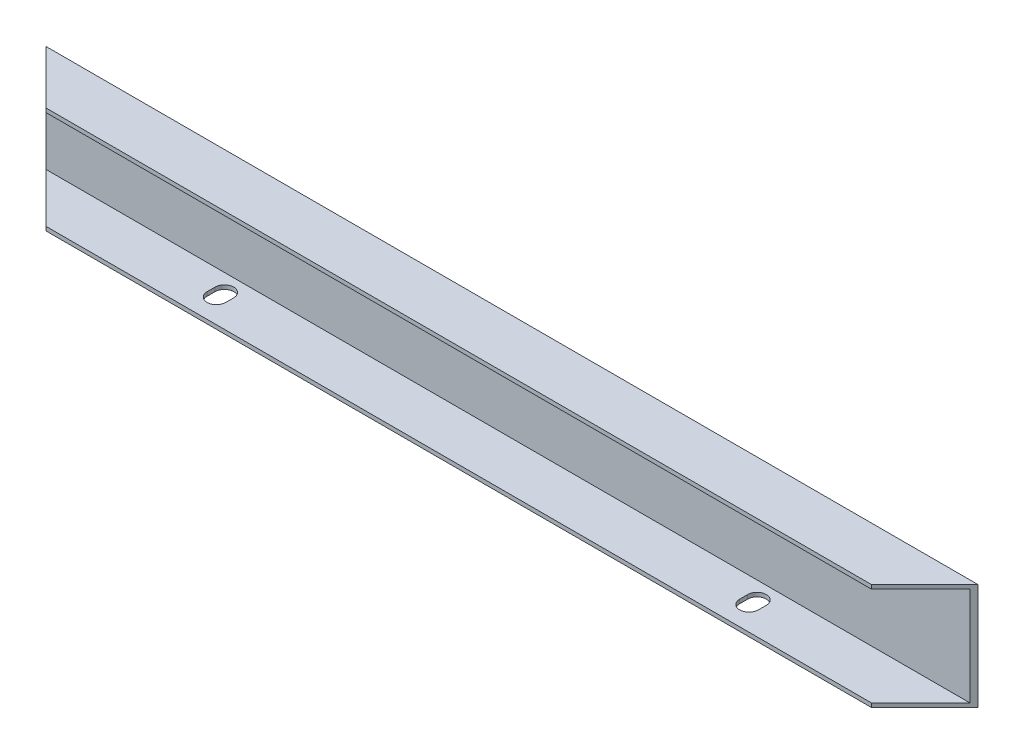
ISO-10303-21;
HEADER;
FILE_DESCRIPTION(('STEP AP214'),'2;1');
FILE_NAME('part.step','',(''),(''),'','','');
FILE_SCHEMA(('AUTOMOTIVE_DESIGN { 1 0 10303 214 1 1 1 1 }'));
ENDSEC;
DATA;
#1=APPLICATION_CONTEXT('core data for automotive mechanical design processes');
#2=APPLICATION_PROTOCOL_DEFINITION('international standard','automotive_design',2000,#1);
#3=PRODUCT_CONTEXT('',#1,'mechanical');
#4=PRODUCT('Part','Part','',(#3));
#5=PRODUCT_RELATED_PRODUCT_CATEGORY('part','',(#4));
#6=PRODUCT_DEFINITION_FORMATION('','',#4);
#7=PRODUCT_DEFINITION_CONTEXT('part definition',#1,'design');
#8=PRODUCT_DEFINITION('design','',#6,#7);
#9=PRODUCT_DEFINITION_SHAPE('','',#8);
#10=(LENGTH_UNIT() NAMED_UNIT(*) SI_UNIT(.MILLI.,.METRE.));
#11=(NAMED_UNIT(*) PLANE_ANGLE_UNIT() SI_UNIT($,.RADIAN.));
#12=(NAMED_UNIT(*) SI_UNIT($,.STERADIAN.) SOLID_ANGLE_UNIT());
#13=UNCERTAINTY_MEASURE_WITH_UNIT(LENGTH_MEASURE(1.E-05),#10,'distance_accuracy_value','');
#14=(GEOMETRIC_REPRESENTATION_CONTEXT(3) GLOBAL_UNCERTAINTY_ASSIGNED_CONTEXT((#13)) GLOBAL_UNIT_ASSIGNED_CONTEXT((#10,
#11,#12)) REPRESENTATION_CONTEXT('',''));
#15=CARTESIAN_POINT('',(0.,0.,0.));
#16=DIRECTION('',(0.,0.,1.));
#17=DIRECTION('',(1.,0.,0.));
#18=AXIS2_PLACEMENT_3D('',#15,#16,#17);
#19=CARTESIAN_POINT('',(175.,20.,0.));
#20=DIRECTION('',(0.,-1.,0.));
#21=DIRECTION('',(0.,0.,-1.));
#22=AXIS2_PLACEMENT_3D('',#19,#20,#21);
#23=PLANE('',#22);
#24=DIRECTION('',(-1.,0.,0.));
#25=VECTOR('',#24,1.);
#26=CARTESIAN_POINT('',(175.,20.,0.));
#27=LINE('',#26,#25);
#28=CARTESIAN_POINT('',(175.,20.,0.));
#29=VERTEX_POINT('',#28);
#30=CARTESIAN_POINT('',(-175.,20.,0.));
#31=VERTEX_POINT('',#30);
#32=EDGE_CURVE('E245',#29,#31,#27,.T.);
#33=ORIENTED_EDGE('',*,*,#32,.T.);
#34=DIRECTION('',(0.707106781186548,0.,0.707106781186547));
#35=VECTOR('',#34,1.);
#36=CARTESIAN_POINT('',(1.38777878078145E-13,20.,175.));
#37=LINE('',#36,#35);
#38=CARTESIAN_POINT('',(-155.,20.,20.));
#39=VERTEX_POINT('',#38);
#40=EDGE_CURVE('E224',#31,#39,#37,.T.);
#41=ORIENTED_EDGE('',*,*,#40,.T.);
#42=DIRECTION('',(-1.,0.,0.));
#43=VECTOR('',#42,1.);
#44=CARTESIAN_POINT('',(175.,20.,20.));
#45=LINE('',#44,#43);
#46=CARTESIAN_POINT('',(155.,20.,20.));
#47=VERTEX_POINT('',#46);
#48=EDGE_CURVE('E11',#47,#39,#45,.T.);
#49=ORIENTED_EDGE('',*,*,#48,.F.);
#50=DIRECTION('',(0.707106781186548,0.,-0.707106781186547));
#51=VECTOR('',#50,1.);
#52=CARTESIAN_POINT('',(175.,20.,0.));
#53=LINE('',#52,#51);
#54=EDGE_CURVE('E239',#47,#29,#53,.T.);
#55=ORIENTED_EDGE('',*,*,#54,.T.);
#56=EDGE_LOOP('',(#33,#41,#49,#55));
#57=FACE_BOUND('',#56,.T.);
#58=ADVANCED_FACE('F33',(#57),#23,.F.);
#59=CARTESIAN_POINT('',(175.,20.,20.));
#60=DIRECTION('',(0.,0.,-1.));
#61=DIRECTION('',(-1.,0.,0.));
#62=AXIS2_PLACEMENT_3D('',#59,#60,#61);
#63=PLANE('',#62);
#64=ORIENTED_EDGE('',*,*,#48,.T.);
#65=DIRECTION('',(0.,1.,0.));
#66=VECTOR('',#65,1.);
#67=CARTESIAN_POINT('',(-155.,-30.,20.));
#68=LINE('',#67,#66);
#69=CARTESIAN_POINT('',(-155.,18.5,20.));
#70=VERTEX_POINT('',#69);
#71=EDGE_CURVE('E206',#70,#39,#68,.T.);
#72=ORIENTED_EDGE('',*,*,#71,.F.);
#73=DIRECTION('',(-1.,0.,0.));
#74=VECTOR('',#73,1.);
#75=CARTESIAN_POINT('',(175.,18.5,20.));
#76=LINE('',#75,#74);
#77=CARTESIAN_POINT('',(155.,18.5,20.));
#78=VERTEX_POINT('',#77);
#79=EDGE_CURVE('E40',#78,#70,#76,.T.);
#80=ORIENTED_EDGE('',*,*,#79,.F.);
#81=DIRECTION('',(0.,1.,0.));
#82=VECTOR('',#81,1.);
#83=CARTESIAN_POINT('',(155.,-30.,20.));
#84=LINE('',#83,#82);
#85=EDGE_CURVE('E178',#78,#47,#84,.T.);
#86=ORIENTED_EDGE('',*,*,#85,.T.);
#87=EDGE_LOOP('',(#64,#72,#80,#86));
#88=FACE_BOUND('',#87,.T.);
#89=ADVANCED_FACE('F271',(#88),#63,.F.);
#90=CARTESIAN_POINT('',(175.,18.5,20.));
#91=DIRECTION('',(0.,1.,0.));
#92=DIRECTION('',(0.,0.,1.));
#93=AXIS2_PLACEMENT_3D('',#90,#91,#92);
#94=PLANE('',#93);
#95=ORIENTED_EDGE('',*,*,#79,.T.);
#96=DIRECTION('',(-0.707106781186548,0.,-0.707106781186547));
#97=VECTOR('',#96,1.);
#98=CARTESIAN_POINT('',(10.0000000000001,18.5,185.));
#99=LINE('',#98,#97);
#100=CARTESIAN_POINT('',(-173.5,18.5,1.5));
#101=VERTEX_POINT('',#100);
#102=EDGE_CURVE('E221',#70,#101,#99,.T.);
#103=ORIENTED_EDGE('',*,*,#102,.T.);
#104=DIRECTION('',(-1.,0.,0.));
#105=VECTOR('',#104,1.);
#106=CARTESIAN_POINT('',(175.,18.5,1.5));
#107=LINE('',#106,#105);
#108=CARTESIAN_POINT('',(173.5,18.5,1.5));
#109=VERTEX_POINT('',#108);
#110=EDGE_CURVE('E262',#109,#101,#107,.T.);
#111=ORIENTED_EDGE('',*,*,#110,.F.);
#112=DIRECTION('',(-0.707106781186548,0.,0.707106781186547));
#113=VECTOR('',#112,1.);
#114=CARTESIAN_POINT('',(165.,18.5,9.99999999999999));
#115=LINE('',#114,#113);
#116=EDGE_CURVE('E236',#109,#78,#115,.T.);
#117=ORIENTED_EDGE('',*,*,#116,.T.);
#118=EDGE_LOOP('',(#95,#103,#111,#117));
#119=FACE_BOUND('',#118,.T.);
#120=ADVANCED_FACE('F267',(#119),#94,.F.);
#121=CARTESIAN_POINT('',(175.,18.5,1.5));
#122=DIRECTION('',(0.,0.,-1.));
#123=DIRECTION('',(-1.,0.,0.));
#124=AXIS2_PLACEMENT_3D('',#121,#122,#123);
#125=PLANE('',#124);
#126=ORIENTED_EDGE('',*,*,#110,.T.);
#127=DIRECTION('',(0.,-1.,0.));
#128=VECTOR('',#127,1.);
#129=CARTESIAN_POINT('',(-173.5,18.5000000000001,1.5));
#130=LINE('',#129,#128);
#131=CARTESIAN_POINT('',(-173.5,-18.5,1.5));
#132=VERTEX_POINT('',#131);
#133=EDGE_CURVE('E218',#101,#132,#130,.T.);
#134=ORIENTED_EDGE('',*,*,#133,.T.);
#135=DIRECTION('',(-1.,0.,0.));
#136=VECTOR('',#135,1.);
#137=CARTESIAN_POINT('',(175.,-18.5,1.5));
#138=LINE('',#137,#136);
#139=CARTESIAN_POINT('',(173.5,-18.5,1.5));
#140=VERTEX_POINT('',#139);
#141=EDGE_CURVE('E259',#140,#132,#138,.T.);
#142=ORIENTED_EDGE('',*,*,#141,.F.);
#143=DIRECTION('',(0.,1.,0.));
#144=VECTOR('',#143,1.);
#145=CARTESIAN_POINT('',(173.5,18.5,1.5));
#146=LINE('',#145,#144);
#147=EDGE_CURVE('E233',#140,#109,#146,.T.);
#148=ORIENTED_EDGE('',*,*,#147,.T.);
#149=EDGE_LOOP('',(#126,#134,#142,#148));
#150=FACE_BOUND('',#149,.T.);
#151=ADVANCED_FACE('F292',(#150),#125,.F.);
#152=CARTESIAN_POINT('',(175.,-18.5,20.));
#153=DIRECTION('',(0.,-1.,0.));
#154=DIRECTION('',(0.,0.,-1.));
#155=AXIS2_PLACEMENT_3D('',#152,#153,#154);
#156=PLANE('',#155);
#157=DIRECTION('',(0.,0.,-1.));
#158=VECTOR('',#157,1.);
#159=CARTESIAN_POINT('',(-96.5,-18.5,8.));
#160=LINE('',#159,#158);
#161=CARTESIAN_POINT('',(-96.5,-18.5,11.));
#162=VERTEX_POINT('',#161);
#163=CARTESIAN_POINT('',(-96.5,-18.5,8.));
#164=VERTEX_POINT('',#163);
#165=EDGE_CURVE('E426',#162,#164,#160,.T.);
#166=ORIENTED_EDGE('',*,*,#165,.F.);
#167=CARTESIAN_POINT('',(-100.,-18.5,11.));
#168=DIRECTION('',(0.,-1.,0.));
#169=DIRECTION('',(0.,0.,-1.));
#170=AXIS2_PLACEMENT_3D('',#167,#168,#169);
#171=CIRCLE('',#170,3.5);
#172=CARTESIAN_POINT('',(-103.5,-18.5,11.));
#173=VERTEX_POINT('',#172);
#174=EDGE_CURVE('E179',#173,#162,#171,.F.);
#175=ORIENTED_EDGE('',*,*,#174,.F.);
#176=DIRECTION('',(0.,0.,1.));
#177=VECTOR('',#176,1.);
#178=CARTESIAN_POINT('',(-103.5,-18.5,11.));
#179=LINE('',#178,#177);
#180=CARTESIAN_POINT('',(-103.5,-18.5,8.));
#181=VERTEX_POINT('',#180);
#182=EDGE_CURVE('E176',#181,#173,#179,.T.);
#183=ORIENTED_EDGE('',*,*,#182,.F.);
#184=CARTESIAN_POINT('',(-100.,-18.5,8.));
#185=DIRECTION('',(0.,-1.,0.));
#186=DIRECTION('',(0.,0.,-1.));
#187=AXIS2_PLACEMENT_3D('',#184,#185,#186);
#188=CIRCLE('',#187,3.5);
#189=EDGE_CURVE('E150',#164,#181,#188,.F.);
#190=ORIENTED_EDGE('',*,*,#189,.F.);
#191=EDGE_LOOP('',(#166,#175,#183,#190));
#192=FACE_BOUND('',#191,.T.);
#193=DIRECTION('',(0.,0.,-1.));
#194=VECTOR('',#193,1.);
#195=CARTESIAN_POINT('',(103.5,-18.5,11.));
#196=LINE('',#195,#194);
#197=CARTESIAN_POINT('',(103.5,-18.5,11.));
#198=VERTEX_POINT('',#197);
#199=CARTESIAN_POINT('',(103.5,-18.5,8.00000000000002));
#200=VERTEX_POINT('',#199);
#201=EDGE_CURVE('E182',#198,#200,#196,.T.);
#202=ORIENTED_EDGE('',*,*,#201,.F.);
#203=CARTESIAN_POINT('',(100.,-18.5,11.));
#204=DIRECTION('',(0.,-1.,0.));
#205=DIRECTION('',(0.,0.,-1.));
#206=AXIS2_PLACEMENT_3D('',#203,#204,#205);
#207=CIRCLE('',#206,3.5);
#208=CARTESIAN_POINT('',(96.5,-18.5,11.));
#209=VERTEX_POINT('',#208);
#210=EDGE_CURVE('E185',#209,#198,#207,.F.);
#211=ORIENTED_EDGE('',*,*,#210,.F.);
#212=DIRECTION('',(0.,0.,1.));
#213=VECTOR('',#212,1.);
#214=CARTESIAN_POINT('',(96.5,-18.5,8.00000000000002));
#215=LINE('',#214,#213);
#216=CARTESIAN_POINT('',(96.5,-18.5,8.00000000000002));
#217=VERTEX_POINT('',#216);
#218=EDGE_CURVE('E187',#217,#209,#215,.T.);
#219=ORIENTED_EDGE('',*,*,#218,.F.);
#220=CARTESIAN_POINT('',(100.,-18.5,8.00000000000002));
#221=DIRECTION('',(0.,-1.,0.));
#222=DIRECTION('',(0.,0.,-1.));
#223=AXIS2_PLACEMENT_3D('',#220,#221,#222);
#224=CIRCLE('',#223,3.5);
#225=EDGE_CURVE('E180',#200,#217,#224,.F.);
#226=ORIENTED_EDGE('',*,*,#225,.F.);
#227=EDGE_LOOP('',(#202,#211,#219,#226));
#228=FACE_BOUND('',#227,.T.);
#229=ORIENTED_EDGE('',*,*,#141,.T.);
#230=DIRECTION('',(0.707106781186548,0.,0.707106781186547));
#231=VECTOR('',#230,1.);
#232=CARTESIAN_POINT('',(10.0000000000001,-18.5,185.));
#233=LINE('',#232,#231);
#234=CARTESIAN_POINT('',(-155.,-18.5,20.));
#235=VERTEX_POINT('',#234);
#236=EDGE_CURVE('E215',#132,#235,#233,.T.);
#237=ORIENTED_EDGE('',*,*,#236,.T.);
#238=DIRECTION('',(-1.,0.,0.));
#239=VECTOR('',#238,1.);
#240=CARTESIAN_POINT('',(175.,-18.5,20.));
#241=LINE('',#240,#239);
#242=CARTESIAN_POINT('',(155.,-18.5,20.));
#243=VERTEX_POINT('',#242);
#244=EDGE_CURVE('E256',#243,#235,#241,.T.);
#245=ORIENTED_EDGE('',*,*,#244,.F.);
#246=DIRECTION('',(0.707106781186548,0.,-0.707106781186547));
#247=VECTOR('',#246,1.);
#248=CARTESIAN_POINT('',(165.,-18.5,9.99999999999999));
#249=LINE('',#248,#247);
#250=EDGE_CURVE('E230',#243,#140,#249,.T.);
#251=ORIENTED_EDGE('',*,*,#250,.T.);
#252=EDGE_LOOP('',(#229,#237,#245,#251));
#253=FACE_BOUND('',#252,.T.);
#254=ADVANCED_FACE('F289',(#192,#228,#253),#156,.F.);
#255=CARTESIAN_POINT('',(175.,-20.,20.));
#256=DIRECTION('',(0.,0.,-1.));
#257=DIRECTION('',(-1.,0.,0.));
#258=AXIS2_PLACEMENT_3D('',#255,#256,#257);
#259=PLANE('',#258);
#260=ORIENTED_EDGE('',*,*,#244,.T.);
#261=CARTESIAN_POINT('',(-155.,-20.,20.));
#262=VERTEX_POINT('',#261);
#263=EDGE_CURVE('E208',#262,#235,#68,.T.);
#264=ORIENTED_EDGE('',*,*,#263,.F.);
#265=DIRECTION('',(-1.,0.,0.));
#266=VECTOR('',#265,1.);
#267=CARTESIAN_POINT('',(175.,-20.,20.));
#268=LINE('',#267,#266);
#269=CARTESIAN_POINT('',(155.,-20.,20.));
#270=VERTEX_POINT('',#269);
#271=EDGE_CURVE('E253',#270,#262,#268,.T.);
#272=ORIENTED_EDGE('',*,*,#271,.F.);
#273=EDGE_CURVE('E209',#270,#243,#84,.T.);
#274=ORIENTED_EDGE('',*,*,#273,.T.);
#275=EDGE_LOOP('',(#260,#264,#272,#274));
#276=FACE_BOUND('',#275,.T.);
#277=ADVANCED_FACE('F286',(#276),#259,.F.);
#278=CARTESIAN_POINT('',(175.,-20.,0.));
#279=DIRECTION('',(0.,1.,0.));
#280=DIRECTION('',(0.,0.,1.));
#281=AXIS2_PLACEMENT_3D('',#278,#279,#280);
#282=PLANE('',#281);
#283=DIRECTION('',(0.,0.,-1.));
#284=VECTOR('',#283,1.);
#285=CARTESIAN_POINT('',(-103.5,-20.,11.));
#286=LINE('',#285,#284);
#287=CARTESIAN_POINT('',(-103.5,-20.,11.));
#288=VERTEX_POINT('',#287);
#289=CARTESIAN_POINT('',(-103.5,-20.,8.));
#290=VERTEX_POINT('',#289);
#291=EDGE_CURVE('E157',#288,#290,#286,.T.);
#292=ORIENTED_EDGE('',*,*,#291,.F.);
#293=CARTESIAN_POINT('',(-100.,-20.,11.));
#294=DIRECTION('',(0.,-1.,0.));
#295=DIRECTION('',(0.,0.,-1.));
#296=AXIS2_PLACEMENT_3D('',#293,#294,#295);
#297=CIRCLE('',#296,3.5);
#298=CARTESIAN_POINT('',(-96.5,-20.,11.));
#299=VERTEX_POINT('',#298);
#300=EDGE_CURVE('E162',#299,#288,#297,.T.);
#301=ORIENTED_EDGE('',*,*,#300,.F.);
#302=DIRECTION('',(0.,0.,1.));
#303=VECTOR('',#302,1.);
#304=CARTESIAN_POINT('',(-96.5,-20.,8.));
#305=LINE('',#304,#303);
#306=CARTESIAN_POINT('',(-96.5,-20.,8.));
#307=VERTEX_POINT('',#306);
#308=EDGE_CURVE('E167',#307,#299,#305,.T.);
#309=ORIENTED_EDGE('',*,*,#308,.F.);
#310=CARTESIAN_POINT('',(-100.,-20.,8.));
#311=DIRECTION('',(0.,-1.,0.));
#312=DIRECTION('',(0.,0.,-1.));
#313=AXIS2_PLACEMENT_3D('',#310,#311,#312);
#314=CIRCLE('',#313,3.5);
#315=EDGE_CURVE('E147',#290,#307,#314,.T.);
#316=ORIENTED_EDGE('',*,*,#315,.F.);
#317=EDGE_LOOP('',(#292,#301,#309,#316));
#318=FACE_BOUND('',#317,.T.);
#319=DIRECTION('',(0.,0.,-1.));
#320=VECTOR('',#319,1.);
#321=CARTESIAN_POINT('',(96.5,-20.,8.00000000000002));
#322=LINE('',#321,#320);
#323=CARTESIAN_POINT('',(96.5,-20.,11.));
#324=VERTEX_POINT('',#323);
#325=CARTESIAN_POINT('',(96.5,-20.,8.00000000000002));
#326=VERTEX_POINT('',#325);
#327=EDGE_CURVE('E190',#324,#326,#322,.T.);
#328=ORIENTED_EDGE('',*,*,#327,.F.);
#329=CARTESIAN_POINT('',(100.,-20.,11.));
#330=DIRECTION('',(0.,-1.,0.));
#331=DIRECTION('',(0.,0.,1.));
#332=AXIS2_PLACEMENT_3D('',#329,#330,#331);
#333=CIRCLE('',#332,3.5);
#334=CARTESIAN_POINT('',(103.5,-20.,11.));
#335=VERTEX_POINT('',#334);
#336=EDGE_CURVE('E188',#335,#324,#333,.T.);
#337=ORIENTED_EDGE('',*,*,#336,.F.);
#338=DIRECTION('',(0.,0.,1.));
#339=VECTOR('',#338,1.);
#340=CARTESIAN_POINT('',(103.5,-20.,11.));
#341=LINE('',#340,#339);
#342=CARTESIAN_POINT('',(103.5,-20.,8.00000000000002));
#343=VERTEX_POINT('',#342);
#344=EDGE_CURVE('E195',#343,#335,#341,.T.);
#345=ORIENTED_EDGE('',*,*,#344,.F.);
#346=CARTESIAN_POINT('',(100.,-20.,8.00000000000002));
#347=DIRECTION('',(0.,-1.,0.));
#348=DIRECTION('',(0.,0.,1.));
#349=AXIS2_PLACEMENT_3D('',#346,#347,#348);
#350=CIRCLE('',#349,3.5);
#351=EDGE_CURVE('E192',#326,#343,#350,.T.);
#352=ORIENTED_EDGE('',*,*,#351,.F.);
#353=EDGE_LOOP('',(#328,#337,#345,#352));
#354=FACE_BOUND('',#353,.T.);
#355=ORIENTED_EDGE('',*,*,#271,.T.);
#356=DIRECTION('',(-0.707106781186548,0.,-0.707106781186547));
#357=VECTOR('',#356,1.);
#358=CARTESIAN_POINT('',(1.38777878078145E-13,-20.,175.));
#359=LINE('',#358,#357);
#360=CARTESIAN_POINT('',(-175.,-20.,0.));
#361=VERTEX_POINT('',#360);
#362=EDGE_CURVE('E212',#262,#361,#359,.T.);
#363=ORIENTED_EDGE('',*,*,#362,.T.);
#364=DIRECTION('',(-1.,0.,0.));
#365=VECTOR('',#364,1.);
#366=CARTESIAN_POINT('',(175.,-20.,0.));
#367=LINE('',#366,#365);
#368=CARTESIAN_POINT('',(175.,-20.,0.));
#369=VERTEX_POINT('',#368);
#370=EDGE_CURVE('E250',#369,#361,#367,.T.);
#371=ORIENTED_EDGE('',*,*,#370,.F.);
#372=DIRECTION('',(-0.707106781186548,0.,0.707106781186547));
#373=VECTOR('',#372,1.);
#374=CARTESIAN_POINT('',(175.,-20.,0.));
#375=LINE('',#374,#373);
#376=EDGE_CURVE('E227',#369,#270,#375,.T.);
#377=ORIENTED_EDGE('',*,*,#376,.T.);
#378=EDGE_LOOP('',(#355,#363,#371,#377));
#379=FACE_BOUND('',#378,.T.);
#380=ADVANCED_FACE('F164',(#318,#354,#379),#282,.F.);
#381=CARTESIAN_POINT('',(175.,20.,0.));
#382=DIRECTION('',(0.,0.,1.));
#383=DIRECTION('',(1.,0.,0.));
#384=AXIS2_PLACEMENT_3D('',#381,#382,#383);
#385=PLANE('',#384);
#386=DIRECTION('',(0.,1.,0.));
#387=VECTOR('',#386,1.);
#388=CARTESIAN_POINT('',(-175.,20.,0.));
#389=LINE('',#388,#387);
#390=EDGE_CURVE('E242',#361,#31,#389,.T.);
#391=ORIENTED_EDGE('',*,*,#390,.T.);
#392=ORIENTED_EDGE('',*,*,#32,.F.);
#393=DIRECTION('',(0.,1.,0.));
#394=VECTOR('',#393,1.);
#395=CARTESIAN_POINT('',(175.,20.,0.));
#396=LINE('',#395,#394);
#397=EDGE_CURVE('E243',#369,#29,#396,.T.);
#398=ORIENTED_EDGE('',*,*,#397,.F.);
#399=ORIENTED_EDGE('',*,*,#370,.T.);
#400=EDGE_LOOP('',(#391,#392,#398,#399));
#401=FACE_BOUND('',#400,.T.);
#402=ADVANCED_FACE('F279',(#401),#385,.F.);
#403=CARTESIAN_POINT('',(-175.,-30.,0.));
#404=DIRECTION('',(0.707106781186547,0.,-0.707106781186548));
#405=DIRECTION('',(-0.707106781186548,0.,-0.707106781186547));
#406=AXIS2_PLACEMENT_3D('',#403,#404,#405);
#407=PLANE('',#406);
#408=ORIENTED_EDGE('',*,*,#390,.F.);
#409=ORIENTED_EDGE('',*,*,#362,.F.);
#410=ORIENTED_EDGE('',*,*,#263,.T.);
#411=ORIENTED_EDGE('',*,*,#236,.F.);
#412=ORIENTED_EDGE('',*,*,#133,.F.);
#413=ORIENTED_EDGE('',*,*,#102,.F.);
#414=ORIENTED_EDGE('',*,*,#71,.T.);
#415=ORIENTED_EDGE('',*,*,#40,.F.);
#416=EDGE_LOOP('',(#408,#409,#410,#411,#412,#413,#414,#415));
#417=FACE_BOUND('',#416,.T.);
#418=ADVANCED_FACE('F274',(#417),#407,.F.);
#419=CARTESIAN_POINT('',(175.,-30.,0.));
#420=DIRECTION('',(-0.707106781186547,0.,-0.707106781186548));
#421=DIRECTION('',(-0.707106781186548,0.,0.707106781186547));
#422=AXIS2_PLACEMENT_3D('',#419,#420,#421);
#423=PLANE('',#422);
#424=ORIENTED_EDGE('',*,*,#85,.F.);
#425=ORIENTED_EDGE('',*,*,#116,.F.);
#426=ORIENTED_EDGE('',*,*,#147,.F.);
#427=ORIENTED_EDGE('',*,*,#250,.F.);
#428=ORIENTED_EDGE('',*,*,#273,.F.);
#429=ORIENTED_EDGE('',*,*,#376,.F.);
#430=ORIENTED_EDGE('',*,*,#397,.T.);
#431=ORIENTED_EDGE('',*,*,#54,.F.);
#432=EDGE_LOOP('',(#424,#425,#426,#427,#428,#429,#430,#431));
#433=FACE_BOUND('',#432,.T.);
#434=ADVANCED_FACE('F294',(#433),#423,.F.);
#435=CARTESIAN_POINT('',(100.,-6.29344438426628,11.));
#436=DIRECTION('',(0.,-1.,0.));
#437=DIRECTION('',(0.,0.,-1.));
#438=AXIS2_PLACEMENT_3D('',#435,#436,#437);
#439=CYLINDRICAL_SURFACE('',#438,3.5);
#440=ORIENTED_EDGE('',*,*,#210,.T.);
#441=DIRECTION('',(0.,-1.,0.));
#442=VECTOR('',#441,1.);
#443=CARTESIAN_POINT('',(103.5,-6.29344438426628,11.));
#444=LINE('',#443,#442);
#445=EDGE_CURVE('E183',#198,#335,#444,.T.);
#446=ORIENTED_EDGE('',*,*,#445,.T.);
#447=ORIENTED_EDGE('',*,*,#336,.T.);
#448=DIRECTION('',(0.,-1.,0.));
#449=VECTOR('',#448,1.);
#450=CARTESIAN_POINT('',(96.5,-6.29344438426628,11.));
#451=LINE('',#450,#449);
#452=EDGE_CURVE('E198',#209,#324,#451,.T.);
#453=ORIENTED_EDGE('',*,*,#452,.F.);
#454=EDGE_LOOP('',(#440,#446,#447,#453));
#455=FACE_BOUND('',#454,.T.);
#456=ADVANCED_FACE('F296',(#455),#439,.F.);
#457=CARTESIAN_POINT('',(103.5,-6.29344438426628,11.));
#458=DIRECTION('',(1.,0.,0.));
#459=DIRECTION('',(0.,0.,-1.));
#460=AXIS2_PLACEMENT_3D('',#457,#458,#459);
#461=PLANE('',#460);
#462=ORIENTED_EDGE('',*,*,#201,.T.);
#463=DIRECTION('',(0.,-1.,0.));
#464=VECTOR('',#463,1.);
#465=CARTESIAN_POINT('',(103.5,-6.29344438426628,8.00000000000003));
#466=LINE('',#465,#464);
#467=EDGE_CURVE('E200',#200,#343,#466,.T.);
#468=ORIENTED_EDGE('',*,*,#467,.T.);
#469=ORIENTED_EDGE('',*,*,#344,.T.);
#470=ORIENTED_EDGE('',*,*,#445,.F.);
#471=EDGE_LOOP('',(#462,#468,#469,#470));
#472=FACE_BOUND('',#471,.T.);
#473=ADVANCED_FACE('F302',(#472),#461,.F.);
#474=CARTESIAN_POINT('',(100.,-6.29344438426628,8.00000000000002));
#475=DIRECTION('',(0.,-1.,0.));
#476=DIRECTION('',(0.,0.,-1.));
#477=AXIS2_PLACEMENT_3D('',#474,#475,#476);
#478=CYLINDRICAL_SURFACE('',#477,3.5);
#479=ORIENTED_EDGE('',*,*,#225,.T.);
#480=DIRECTION('',(0.,-1.,0.));
#481=VECTOR('',#480,1.);
#482=CARTESIAN_POINT('',(96.5,-6.29344438426628,8.00000000000002));
#483=LINE('',#482,#481);
#484=EDGE_CURVE('E55',#217,#326,#483,.T.);
#485=ORIENTED_EDGE('',*,*,#484,.T.);
#486=ORIENTED_EDGE('',*,*,#351,.T.);
#487=ORIENTED_EDGE('',*,*,#467,.F.);
#488=EDGE_LOOP('',(#479,#485,#486,#487));
#489=FACE_BOUND('',#488,.T.);
#490=ADVANCED_FACE('F365',(#489),#478,.F.);
#491=CARTESIAN_POINT('',(96.5,-6.29344438426628,8.00000000000002));
#492=DIRECTION('',(-1.,0.,0.));
#493=DIRECTION('',(0.,0.,1.));
#494=AXIS2_PLACEMENT_3D('',#491,#492,#493);
#495=PLANE('',#494);
#496=ORIENTED_EDGE('',*,*,#218,.T.);
#497=ORIENTED_EDGE('',*,*,#452,.T.);
#498=ORIENTED_EDGE('',*,*,#327,.T.);
#499=ORIENTED_EDGE('',*,*,#484,.F.);
#500=EDGE_LOOP('',(#496,#497,#498,#499));
#501=FACE_BOUND('',#500,.T.);
#502=ADVANCED_FACE('F375',(#501),#495,.F.);
#503=CARTESIAN_POINT('',(-100.,-6.29344438426628,11.));
#504=DIRECTION('',(0.,-1.,0.));
#505=DIRECTION('',(0.,0.,-1.));
#506=AXIS2_PLACEMENT_3D('',#503,#504,#505);
#507=CYLINDRICAL_SURFACE('',#506,3.5);
#508=ORIENTED_EDGE('',*,*,#174,.T.);
#509=DIRECTION('',(0.,-1.,0.));
#510=VECTOR('',#509,1.);
#511=CARTESIAN_POINT('',(-96.5,-6.29344438426628,11.));
#512=LINE('',#511,#510);
#513=EDGE_CURVE('E172',#162,#299,#512,.T.);
#514=ORIENTED_EDGE('',*,*,#513,.T.);
#515=ORIENTED_EDGE('',*,*,#300,.T.);
#516=DIRECTION('',(0.,-1.,0.));
#517=VECTOR('',#516,1.);
#518=CARTESIAN_POINT('',(-103.5,-6.29344438426628,11.));
#519=LINE('',#518,#517);
#520=EDGE_CURVE('E153',#173,#288,#519,.T.);
#521=ORIENTED_EDGE('',*,*,#520,.F.);
#522=EDGE_LOOP('',(#508,#514,#515,#521));
#523=FACE_BOUND('',#522,.T.);
#524=ADVANCED_FACE('F385',(#523),#507,.F.);
#525=CARTESIAN_POINT('',(-96.5,-6.29344438426628,8.));
#526=DIRECTION('',(1.,0.,0.));
#527=DIRECTION('',(0.,0.,-1.));
#528=AXIS2_PLACEMENT_3D('',#525,#526,#527);
#529=PLANE('',#528);
#530=ORIENTED_EDGE('',*,*,#165,.T.);
#531=DIRECTION('',(0.,-1.,0.));
#532=VECTOR('',#531,1.);
#533=CARTESIAN_POINT('',(-96.5,-6.29344438426628,8.));
#534=LINE('',#533,#532);
#535=EDGE_CURVE('E152',#164,#307,#534,.T.);
#536=ORIENTED_EDGE('',*,*,#535,.T.);
#537=ORIENTED_EDGE('',*,*,#308,.T.);
#538=ORIENTED_EDGE('',*,*,#513,.F.);
#539=EDGE_LOOP('',(#530,#536,#537,#538));
#540=FACE_BOUND('',#539,.T.);
#541=ADVANCED_FACE('F394',(#540),#529,.F.);
#542=CARTESIAN_POINT('',(-100.,-6.29344438426628,8.));
#543=DIRECTION('',(0.,-1.,0.));
#544=DIRECTION('',(0.,0.,-1.));
#545=AXIS2_PLACEMENT_3D('',#542,#543,#544);
#546=CYLINDRICAL_SURFACE('',#545,3.5);
#547=ORIENTED_EDGE('',*,*,#189,.T.);
#548=DIRECTION('',(0.,-1.,0.));
#549=VECTOR('',#548,1.);
#550=CARTESIAN_POINT('',(-103.5,-6.29344438426628,8.));
#551=LINE('',#550,#549);
#552=EDGE_CURVE('E47',#181,#290,#551,.T.);
#553=ORIENTED_EDGE('',*,*,#552,.T.);
#554=ORIENTED_EDGE('',*,*,#315,.T.);
#555=ORIENTED_EDGE('',*,*,#535,.F.);
#556=EDGE_LOOP('',(#547,#553,#554,#555));
#557=FACE_BOUND('',#556,.T.);
#558=ADVANCED_FACE('F144',(#557),#546,.F.);
#559=CARTESIAN_POINT('',(-103.5,-6.29344438426628,11.));
#560=DIRECTION('',(-1.,0.,0.));
#561=DIRECTION('',(0.,0.,1.));
#562=AXIS2_PLACEMENT_3D('',#559,#560,#561);
#563=PLANE('',#562);
#564=ORIENTED_EDGE('',*,*,#182,.T.);
#565=ORIENTED_EDGE('',*,*,#520,.T.);
#566=ORIENTED_EDGE('',*,*,#291,.T.);
#567=ORIENTED_EDGE('',*,*,#552,.F.);
#568=EDGE_LOOP('',(#564,#565,#566,#567));
#569=FACE_BOUND('',#568,.T.);
#570=ADVANCED_FACE('F158',(#569),#563,.F.);
#571=CLOSED_SHELL('',(#58,#89,#120,#151,#254,#277,#380,#402,#418,#434,#456,#473,#490,#502,#524,
#541,#558,#570));
#572=MANIFOLD_SOLID_BREP('B2',#571);
#573=ADVANCED_BREP_SHAPE_REPRESENTATION('',(#18,#572),#14);
#574=SHAPE_DEFINITION_REPRESENTATION(#9,#573);
ENDSEC;
END-ISO-10303-21;
